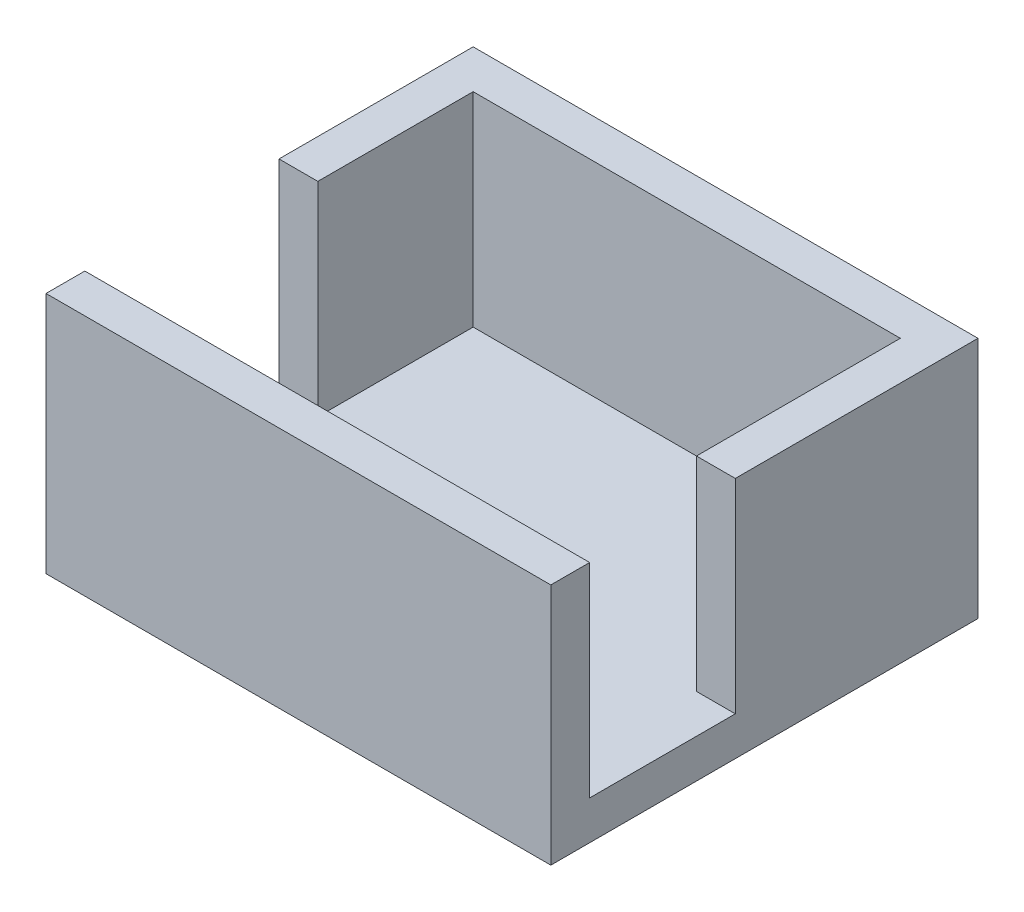
ISO-10303-21;
HEADER;
FILE_DESCRIPTION(('STEP AP214'),'2;1');
FILE_NAME('part.step','',(''),(''),'','','');
FILE_SCHEMA(('AUTOMOTIVE_DESIGN { 1 0 10303 214 1 1 1 1 }'));
ENDSEC;
DATA;
#1=APPLICATION_CONTEXT('core data for automotive mechanical design processes');
#2=APPLICATION_PROTOCOL_DEFINITION('international standard','automotive_design',2000,#1);
#3=PRODUCT_CONTEXT('',#1,'mechanical');
#4=PRODUCT('Part','Part','',(#3));
#5=PRODUCT_RELATED_PRODUCT_CATEGORY('part','',(#4));
#6=PRODUCT_DEFINITION_FORMATION('','',#4);
#7=PRODUCT_DEFINITION_CONTEXT('part definition',#1,'design');
#8=PRODUCT_DEFINITION('design','',#6,#7);
#9=PRODUCT_DEFINITION_SHAPE('','',#8);
#10=(LENGTH_UNIT() NAMED_UNIT(*) SI_UNIT(.MILLI.,.METRE.));
#11=(NAMED_UNIT(*) PLANE_ANGLE_UNIT() SI_UNIT($,.RADIAN.));
#12=(NAMED_UNIT(*) SI_UNIT($,.STERADIAN.) SOLID_ANGLE_UNIT());
#13=UNCERTAINTY_MEASURE_WITH_UNIT(LENGTH_MEASURE(1.E-05),#10,'distance_accuracy_value','');
#14=(GEOMETRIC_REPRESENTATION_CONTEXT(3) GLOBAL_UNCERTAINTY_ASSIGNED_CONTEXT((#13)) GLOBAL_UNIT_ASSIGNED_CONTEXT((#10,
#11,#12)) REPRESENTATION_CONTEXT('',''));
#15=CARTESIAN_POINT('',(0.,0.,0.));
#16=DIRECTION('',(0.,0.,1.));
#17=DIRECTION('',(1.,0.,0.));
#18=AXIS2_PLACEMENT_3D('',#15,#16,#17);
#19=CARTESIAN_POINT('',(0.,12.5,0.));
#20=DIRECTION('',(0.,-1.,0.));
#21=DIRECTION('',(0.,0.,-1.));
#22=AXIS2_PLACEMENT_3D('',#19,#20,#21);
#23=PLANE('',#22);
#24=DIRECTION('',(1.,0.,0.));
#25=VECTOR('',#24,1.);
#26=CARTESIAN_POINT('',(0.,12.5,0.));
#27=LINE('',#26,#25);
#28=CARTESIAN_POINT('',(-2.,12.5,0.));
#29=VERTEX_POINT('',#28);
#30=CARTESIAN_POINT('',(24.,12.5,0.));
#31=VERTEX_POINT('',#30);
#32=EDGE_CURVE('E155',#29,#31,#27,.T.);
#33=ORIENTED_EDGE('',*,*,#32,.F.);
#34=DIRECTION('',(0.,0.,1.));
#35=VECTOR('',#34,1.);
#36=CARTESIAN_POINT('',(-2.,12.5,2.));
#37=LINE('',#36,#35);
#38=CARTESIAN_POINT('',(-2.,12.5,2.));
#39=VERTEX_POINT('',#38);
#40=EDGE_CURVE('E178',#29,#39,#37,.T.);
#41=ORIENTED_EDGE('',*,*,#40,.T.);
#42=DIRECTION('',(1.,0.,0.));
#43=VECTOR('',#42,1.);
#44=CARTESIAN_POINT('',(-2.,12.5,2.));
#45=LINE('',#44,#43);
#46=CARTESIAN_POINT('',(24.,12.5,2.));
#47=VERTEX_POINT('',#46);
#48=EDGE_CURVE('E181',#39,#47,#45,.T.);
#49=ORIENTED_EDGE('',*,*,#48,.T.);
#50=DIRECTION('',(0.,0.,-1.));
#51=VECTOR('',#50,1.);
#52=CARTESIAN_POINT('',(24.,12.5,2.));
#53=LINE('',#52,#51);
#54=EDGE_CURVE('E186',#47,#31,#53,.T.);
#55=ORIENTED_EDGE('',*,*,#54,.T.);
#56=EDGE_LOOP('',(#33,#41,#49,#55));
#57=FACE_BOUND('',#56,.T.);
#58=ADVANCED_FACE('F39',(#57),#23,.F.);
#59=CARTESIAN_POINT('',(-2.,2.,0.));
#60=DIRECTION('',(-1.,0.,0.));
#61=DIRECTION('',(0.,0.,1.));
#62=AXIS2_PLACEMENT_3D('',#59,#60,#61);
#63=PLANE('',#62);
#64=DIRECTION('',(0.,1.,0.));
#65=VECTOR('',#64,1.);
#66=CARTESIAN_POINT('',(-2.,-8.19803902718557,0.));
#67=LINE('',#66,#65);
#68=CARTESIAN_POINT('',(-2.,2.,0.));
#69=VERTEX_POINT('',#68);
#70=EDGE_CURVE('E313',#69,#29,#67,.T.);
#71=ORIENTED_EDGE('',*,*,#70,.F.);
#72=DIRECTION('',(0.,0.,-1.));
#73=VECTOR('',#72,1.);
#74=CARTESIAN_POINT('',(-2.,2.,0.));
#75=LINE('',#74,#73);
#76=CARTESIAN_POINT('',(-2.,2.,-10.));
#77=VERTEX_POINT('',#76);
#78=EDGE_CURVE('E161',#69,#77,#75,.T.);
#79=ORIENTED_EDGE('',*,*,#78,.T.);
#80=DIRECTION('',(0.,1.,0.));
#81=VECTOR('',#80,1.);
#82=CARTESIAN_POINT('',(-2.,-8.19803902718557,-10.));
#83=LINE('',#82,#81);
#84=CARTESIAN_POINT('',(-2.,12.5,-10.));
#85=VERTEX_POINT('',#84);
#86=EDGE_CURVE('E137',#77,#85,#83,.T.);
#87=ORIENTED_EDGE('',*,*,#86,.T.);
#88=CARTESIAN_POINT('',(-2.,12.5,-20.));
#89=VERTEX_POINT('',#88);
#90=EDGE_CURVE('E147',#89,#85,#37,.T.);
#91=ORIENTED_EDGE('',*,*,#90,.F.);
#92=DIRECTION('',(0.,-1.,0.));
#93=VECTOR('',#92,1.);
#94=CARTESIAN_POINT('',(-2.,2.,-20.));
#95=LINE('',#94,#93);
#96=CARTESIAN_POINT('',(-2.,0.,-20.));
#97=VERTEX_POINT('',#96);
#98=EDGE_CURVE('E221',#89,#97,#95,.T.);
#99=ORIENTED_EDGE('',*,*,#98,.T.);
#100=DIRECTION('',(0.,0.,-1.));
#101=VECTOR('',#100,1.);
#102=CARTESIAN_POINT('',(-2.,0.,0.));
#103=LINE('',#102,#101);
#104=CARTESIAN_POINT('',(-2.,0.,2.));
#105=VERTEX_POINT('',#104);
#106=EDGE_CURVE('E206',#105,#97,#103,.T.);
#107=ORIENTED_EDGE('',*,*,#106,.F.);
#108=DIRECTION('',(0.,-1.,0.));
#109=VECTOR('',#108,1.);
#110=CARTESIAN_POINT('',(-2.,2.,2.));
#111=LINE('',#110,#109);
#112=EDGE_CURVE('E11',#39,#105,#111,.T.);
#113=ORIENTED_EDGE('',*,*,#112,.F.);
#114=ORIENTED_EDGE('',*,*,#40,.F.);
#115=EDGE_LOOP('',(#71,#79,#87,#91,#99,#107,#113,#114));
#116=FACE_BOUND('',#115,.T.);
#117=ADVANCED_FACE('F41',(#116),#63,.T.);
#118=CARTESIAN_POINT('',(0.,2.,2.));
#119=DIRECTION('',(0.,0.,-1.));
#120=DIRECTION('',(-1.,0.,0.));
#121=AXIS2_PLACEMENT_3D('',#118,#119,#120);
#122=PLANE('',#121);
#123=DIRECTION('',(1.,0.,0.));
#124=VECTOR('',#123,1.);
#125=CARTESIAN_POINT('',(0.,0.,2.));
#126=LINE('',#125,#124);
#127=CARTESIAN_POINT('',(24.,0.,2.));
#128=VERTEX_POINT('',#127);
#129=EDGE_CURVE('E210',#105,#128,#126,.T.);
#130=ORIENTED_EDGE('',*,*,#129,.T.);
#131=DIRECTION('',(0.,-1.,0.));
#132=VECTOR('',#131,1.);
#133=CARTESIAN_POINT('',(24.,2.,2.));
#134=LINE('',#133,#132);
#135=EDGE_CURVE('E48',#47,#128,#134,.T.);
#136=ORIENTED_EDGE('',*,*,#135,.F.);
#137=ORIENTED_EDGE('',*,*,#48,.F.);
#138=ORIENTED_EDGE('',*,*,#112,.T.);
#139=EDGE_LOOP('',(#130,#136,#137,#138));
#140=FACE_BOUND('',#139,.T.);
#141=ADVANCED_FACE('F257',(#140),#122,.F.);
#142=CARTESIAN_POINT('',(24.,2.,0.));
#143=DIRECTION('',(-1.,0.,0.));
#144=DIRECTION('',(0.,0.,1.));
#145=AXIS2_PLACEMENT_3D('',#142,#143,#144);
#146=PLANE('',#145);
#147=CARTESIAN_POINT('',(24.,12.5,-7.5));
#148=VERTEX_POINT('',#147);
#149=CARTESIAN_POINT('',(24.,12.5,-20.));
#150=VERTEX_POINT('',#149);
#151=EDGE_CURVE('E185',#148,#150,#53,.T.);
#152=ORIENTED_EDGE('',*,*,#151,.F.);
#153=DIRECTION('',(0.,1.,0.));
#154=VECTOR('',#153,1.);
#155=CARTESIAN_POINT('',(24.,-8.19803902718557,-7.5));
#156=LINE('',#155,#154);
#157=CARTESIAN_POINT('',(24.,2.,-7.5));
#158=VERTEX_POINT('',#157);
#159=EDGE_CURVE('E247',#158,#148,#156,.T.);
#160=ORIENTED_EDGE('',*,*,#159,.F.);
#161=DIRECTION('',(0.,0.,1.));
#162=VECTOR('',#161,1.);
#163=CARTESIAN_POINT('',(24.,2.,0.));
#164=LINE('',#163,#162);
#165=CARTESIAN_POINT('',(24.,2.,0.));
#166=VERTEX_POINT('',#165);
#167=EDGE_CURVE('E301',#158,#166,#164,.T.);
#168=ORIENTED_EDGE('',*,*,#167,.T.);
#169=DIRECTION('',(0.,1.,0.));
#170=VECTOR('',#169,1.);
#171=CARTESIAN_POINT('',(24.,-8.19803902718557,0.));
#172=LINE('',#171,#170);
#173=EDGE_CURVE('E164',#166,#31,#172,.T.);
#174=ORIENTED_EDGE('',*,*,#173,.T.);
#175=ORIENTED_EDGE('',*,*,#54,.F.);
#176=ORIENTED_EDGE('',*,*,#135,.T.);
#177=DIRECTION('',(0.,0.,-1.));
#178=VECTOR('',#177,1.);
#179=CARTESIAN_POINT('',(24.,0.,0.));
#180=LINE('',#179,#178);
#181=CARTESIAN_POINT('',(24.,0.,-20.));
#182=VERTEX_POINT('',#181);
#183=EDGE_CURVE('E213',#128,#182,#180,.T.);
#184=ORIENTED_EDGE('',*,*,#183,.T.);
#185=DIRECTION('',(0.,-1.,0.));
#186=VECTOR('',#185,1.);
#187=CARTESIAN_POINT('',(24.,2.,-20.));
#188=LINE('',#187,#186);
#189=EDGE_CURVE('E224',#150,#182,#188,.T.);
#190=ORIENTED_EDGE('',*,*,#189,.F.);
#191=EDGE_LOOP('',(#152,#160,#168,#174,#175,#176,#184,#190));
#192=FACE_BOUND('',#191,.T.);
#193=ADVANCED_FACE('F232',(#192),#146,.F.);
#194=CARTESIAN_POINT('',(0.,2.,-20.));
#195=DIRECTION('',(0.,0.,-1.));
#196=DIRECTION('',(-1.,0.,0.));
#197=AXIS2_PLACEMENT_3D('',#194,#195,#196);
#198=PLANE('',#197);
#199=DIRECTION('',(1.,0.,0.));
#200=VECTOR('',#199,1.);
#201=CARTESIAN_POINT('',(0.,0.,-20.));
#202=LINE('',#201,#200);
#203=EDGE_CURVE('E217',#97,#182,#202,.T.);
#204=ORIENTED_EDGE('',*,*,#203,.F.);
#205=ORIENTED_EDGE('',*,*,#98,.F.);
#206=DIRECTION('',(-1.,0.,0.));
#207=VECTOR('',#206,1.);
#208=CARTESIAN_POINT('',(-2.,12.5,-20.));
#209=LINE('',#208,#207);
#210=EDGE_CURVE('E190',#150,#89,#209,.T.);
#211=ORIENTED_EDGE('',*,*,#210,.F.);
#212=ORIENTED_EDGE('',*,*,#189,.T.);
#213=EDGE_LOOP('',(#204,#205,#211,#212));
#214=FACE_BOUND('',#213,.T.);
#215=ADVANCED_FACE('F243',(#214),#198,.T.);
#216=CARTESIAN_POINT('',(0.,0.,0.));
#217=DIRECTION('',(0.,1.,0.));
#218=DIRECTION('',(0.,0.,1.));
#219=AXIS2_PLACEMENT_3D('',#216,#217,#218);
#220=PLANE('',#219);
#221=ORIENTED_EDGE('',*,*,#106,.T.);
#222=ORIENTED_EDGE('',*,*,#203,.T.);
#223=ORIENTED_EDGE('',*,*,#183,.F.);
#224=ORIENTED_EDGE('',*,*,#129,.F.);
#225=EDGE_LOOP('',(#221,#222,#223,#224));
#226=FACE_BOUND('',#225,.T.);
#227=ADVANCED_FACE('F239',(#226),#220,.F.);
#228=ORIENTED_EDGE('',*,*,#90,.T.);
#229=DIRECTION('',(-1.,0.,0.));
#230=VECTOR('',#229,1.);
#231=CARTESIAN_POINT('',(0.,12.5,-10.));
#232=LINE('',#231,#230);
#233=CARTESIAN_POINT('',(0.,12.5,-10.));
#234=VERTEX_POINT('',#233);
#235=EDGE_CURVE('E131',#234,#85,#232,.T.);
#236=ORIENTED_EDGE('',*,*,#235,.F.);
#237=DIRECTION('',(0.,0.,1.));
#238=VECTOR('',#237,1.);
#239=CARTESIAN_POINT('',(0.,12.5,0.));
#240=LINE('',#239,#238);
#241=CARTESIAN_POINT('',(0.,12.5,-18.));
#242=VERTEX_POINT('',#241);
#243=EDGE_CURVE('E144',#242,#234,#240,.T.);
#244=ORIENTED_EDGE('',*,*,#243,.F.);
#245=DIRECTION('',(-1.,0.,0.));
#246=VECTOR('',#245,1.);
#247=CARTESIAN_POINT('',(0.,12.5,-18.));
#248=LINE('',#247,#246);
#249=CARTESIAN_POINT('',(22.,12.5,-18.));
#250=VERTEX_POINT('',#249);
#251=EDGE_CURVE('E169',#250,#242,#248,.T.);
#252=ORIENTED_EDGE('',*,*,#251,.F.);
#253=DIRECTION('',(0.,0.,-1.));
#254=VECTOR('',#253,1.);
#255=CARTESIAN_POINT('',(22.,12.5,0.));
#256=LINE('',#255,#254);
#257=CARTESIAN_POINT('',(22.,12.5,-7.5));
#258=VERTEX_POINT('',#257);
#259=EDGE_CURVE('E159',#258,#250,#256,.T.);
#260=ORIENTED_EDGE('',*,*,#259,.F.);
#261=DIRECTION('',(-1.,0.,0.));
#262=VECTOR('',#261,1.);
#263=CARTESIAN_POINT('',(22.,12.5,-7.5));
#264=LINE('',#263,#262);
#265=EDGE_CURVE('E298',#148,#258,#264,.T.);
#266=ORIENTED_EDGE('',*,*,#265,.F.);
#267=ORIENTED_EDGE('',*,*,#151,.T.);
#268=ORIENTED_EDGE('',*,*,#210,.T.);
#269=EDGE_LOOP('',(#228,#236,#244,#252,#260,#266,#267,#268));
#270=FACE_BOUND('',#269,.T.);
#271=ADVANCED_FACE('F142',(#270),#23,.F.);
#272=CARTESIAN_POINT('',(0.,12.5,0.));
#273=DIRECTION('',(1.,0.,0.));
#274=DIRECTION('',(0.,0.,-1.));
#275=AXIS2_PLACEMENT_3D('',#272,#273,#274);
#276=PLANE('',#275);
#277=DIRECTION('',(0.,1.,0.));
#278=VECTOR('',#277,1.);
#279=CARTESIAN_POINT('',(0.,-8.19803902718557,-10.));
#280=LINE('',#279,#278);
#281=CARTESIAN_POINT('',(0.,2.,-10.));
#282=VERTEX_POINT('',#281);
#283=EDGE_CURVE('E128',#282,#234,#280,.T.);
#284=ORIENTED_EDGE('',*,*,#283,.F.);
#285=DIRECTION('',(0.,0.,-1.));
#286=VECTOR('',#285,1.);
#287=CARTESIAN_POINT('',(0.,2.,0.));
#288=LINE('',#287,#286);
#289=CARTESIAN_POINT('',(0.,2.,-18.));
#290=VERTEX_POINT('',#289);
#291=EDGE_CURVE('E63',#282,#290,#288,.T.);
#292=ORIENTED_EDGE('',*,*,#291,.T.);
#293=DIRECTION('',(0.,-1.,0.));
#294=VECTOR('',#293,1.);
#295=CARTESIAN_POINT('',(0.,12.5,-18.));
#296=LINE('',#295,#294);
#297=EDGE_CURVE('E153',#242,#290,#296,.T.);
#298=ORIENTED_EDGE('',*,*,#297,.F.);
#299=ORIENTED_EDGE('',*,*,#243,.T.);
#300=EDGE_LOOP('',(#284,#292,#298,#299));
#301=FACE_BOUND('',#300,.T.);
#302=ADVANCED_FACE('F151',(#301),#276,.T.);
#303=CARTESIAN_POINT('',(0.,12.5,0.));
#304=DIRECTION('',(0.,0.,-1.));
#305=DIRECTION('',(-1.,0.,0.));
#306=AXIS2_PLACEMENT_3D('',#303,#304,#305);
#307=PLANE('',#306);
#308=ORIENTED_EDGE('',*,*,#32,.T.);
#309=ORIENTED_EDGE('',*,*,#173,.F.);
#310=DIRECTION('',(-1.,0.,0.));
#311=VECTOR('',#310,1.);
#312=CARTESIAN_POINT('',(0.,2.,0.));
#313=LINE('',#312,#311);
#314=EDGE_CURVE('E201',#166,#69,#313,.T.);
#315=ORIENTED_EDGE('',*,*,#314,.T.);
#316=ORIENTED_EDGE('',*,*,#70,.T.);
#317=EDGE_LOOP('',(#308,#309,#315,#316));
#318=FACE_BOUND('',#317,.T.);
#319=ADVANCED_FACE('F275',(#318),#307,.T.);
#320=CARTESIAN_POINT('',(22.,12.5,0.));
#321=DIRECTION('',(-1.,0.,0.));
#322=DIRECTION('',(0.,0.,1.));
#323=AXIS2_PLACEMENT_3D('',#320,#321,#322);
#324=PLANE('',#323);
#325=DIRECTION('',(0.,1.,0.));
#326=VECTOR('',#325,1.);
#327=CARTESIAN_POINT('',(22.,-8.19803902718557,-7.5));
#328=LINE('',#327,#326);
#329=CARTESIAN_POINT('',(22.,2.,-7.5));
#330=VERTEX_POINT('',#329);
#331=EDGE_CURVE('E55',#330,#258,#328,.T.);
#332=ORIENTED_EDGE('',*,*,#331,.T.);
#333=ORIENTED_EDGE('',*,*,#259,.T.);
#334=DIRECTION('',(0.,-1.,0.));
#335=VECTOR('',#334,1.);
#336=CARTESIAN_POINT('',(22.,12.5,-18.));
#337=LINE('',#336,#335);
#338=CARTESIAN_POINT('',(22.,2.,-18.));
#339=VERTEX_POINT('',#338);
#340=EDGE_CURVE('E174',#250,#339,#337,.T.);
#341=ORIENTED_EDGE('',*,*,#340,.T.);
#342=DIRECTION('',(0.,0.,1.));
#343=VECTOR('',#342,1.);
#344=CARTESIAN_POINT('',(22.,2.,0.));
#345=LINE('',#344,#343);
#346=EDGE_CURVE('E197',#339,#330,#345,.T.);
#347=ORIENTED_EDGE('',*,*,#346,.T.);
#348=EDGE_LOOP('',(#332,#333,#341,#347));
#349=FACE_BOUND('',#348,.T.);
#350=ADVANCED_FACE('F291',(#349),#324,.T.);
#351=CARTESIAN_POINT('',(0.,12.5,-18.));
#352=DIRECTION('',(0.,0.,1.));
#353=DIRECTION('',(1.,0.,0.));
#354=AXIS2_PLACEMENT_3D('',#351,#352,#353);
#355=PLANE('',#354);
#356=ORIENTED_EDGE('',*,*,#297,.T.);
#357=DIRECTION('',(1.,0.,0.));
#358=VECTOR('',#357,1.);
#359=CARTESIAN_POINT('',(0.,2.,-18.));
#360=LINE('',#359,#358);
#361=EDGE_CURVE('E193',#290,#339,#360,.T.);
#362=ORIENTED_EDGE('',*,*,#361,.T.);
#363=ORIENTED_EDGE('',*,*,#340,.F.);
#364=ORIENTED_EDGE('',*,*,#251,.T.);
#365=EDGE_LOOP('',(#356,#362,#363,#364));
#366=FACE_BOUND('',#365,.T.);
#367=ADVANCED_FACE('F284',(#366),#355,.T.);
#368=CARTESIAN_POINT('',(0.,2.,0.));
#369=DIRECTION('',(0.,1.,0.));
#370=DIRECTION('',(0.,0.,1.));
#371=AXIS2_PLACEMENT_3D('',#368,#369,#370);
#372=PLANE('',#371);
#373=ORIENTED_EDGE('',*,*,#291,.F.);
#374=DIRECTION('',(1.,0.,0.));
#375=VECTOR('',#374,1.);
#376=CARTESIAN_POINT('',(0.,2.,-10.));
#377=LINE('',#376,#375);
#378=EDGE_CURVE('E134',#77,#282,#377,.T.);
#379=ORIENTED_EDGE('',*,*,#378,.F.);
#380=ORIENTED_EDGE('',*,*,#78,.F.);
#381=ORIENTED_EDGE('',*,*,#314,.F.);
#382=ORIENTED_EDGE('',*,*,#167,.F.);
#383=DIRECTION('',(1.,0.,0.));
#384=VECTOR('',#383,1.);
#385=CARTESIAN_POINT('',(22.,2.,-7.5));
#386=LINE('',#385,#384);
#387=EDGE_CURVE('E149',#330,#158,#386,.T.);
#388=ORIENTED_EDGE('',*,*,#387,.F.);
#389=ORIENTED_EDGE('',*,*,#346,.F.);
#390=ORIENTED_EDGE('',*,*,#361,.F.);
#391=EDGE_LOOP('',(#373,#379,#380,#381,#382,#388,#389,#390));
#392=FACE_BOUND('',#391,.T.);
#393=ADVANCED_FACE('F281',(#392),#372,.T.);
#394=CARTESIAN_POINT('',(22.,-8.19803902718557,-7.5));
#395=DIRECTION('',(0.,0.,-1.));
#396=DIRECTION('',(-1.,0.,0.));
#397=AXIS2_PLACEMENT_3D('',#394,#395,#396);
#398=PLANE('',#397);
#399=ORIENTED_EDGE('',*,*,#387,.T.);
#400=ORIENTED_EDGE('',*,*,#159,.T.);
#401=ORIENTED_EDGE('',*,*,#265,.T.);
#402=ORIENTED_EDGE('',*,*,#331,.F.);
#403=EDGE_LOOP('',(#399,#400,#401,#402));
#404=FACE_BOUND('',#403,.T.);
#405=ADVANCED_FACE('F283',(#404),#398,.F.);
#406=CARTESIAN_POINT('',(0.,-8.19803902718557,-10.));
#407=DIRECTION('',(0.,0.,-1.));
#408=DIRECTION('',(-1.,0.,0.));
#409=AXIS2_PLACEMENT_3D('',#406,#407,#408);
#410=PLANE('',#409);
#411=ORIENTED_EDGE('',*,*,#378,.T.);
#412=ORIENTED_EDGE('',*,*,#283,.T.);
#413=ORIENTED_EDGE('',*,*,#235,.T.);
#414=ORIENTED_EDGE('',*,*,#86,.F.);
#415=EDGE_LOOP('',(#411,#412,#413,#414));
#416=FACE_BOUND('',#415,.T.);
#417=ADVANCED_FACE('F130',(#416),#410,.F.);
#418=CLOSED_SHELL('',(#58,#117,#141,#193,#215,#227,#271,#302,#319,#350,#367,#393,#405,#417));
#419=MANIFOLD_SOLID_BREP('B2',#418);
#420=ADVANCED_BREP_SHAPE_REPRESENTATION('',(#18,#419),#14);
#421=SHAPE_DEFINITION_REPRESENTATION(#9,#420);
ENDSEC;
END-ISO-10303-21;
